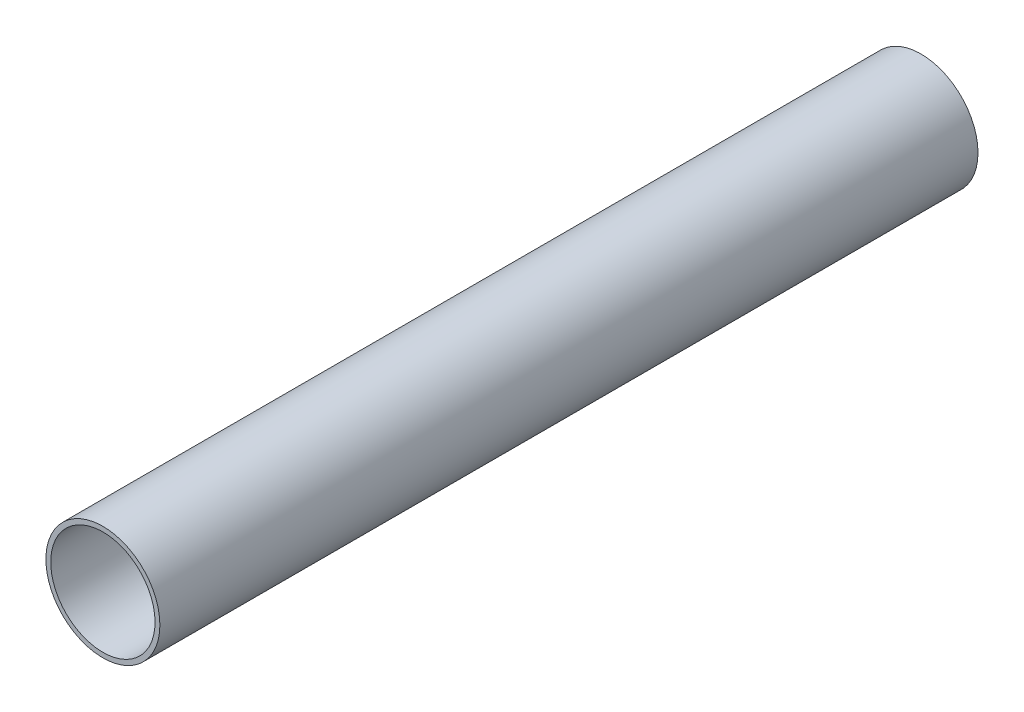
ISO-10303-21;
HEADER;
FILE_DESCRIPTION(('STEP AP214'),'2;1');
FILE_NAME('part.step','',(''),(''),'','','');
FILE_SCHEMA(('AUTOMOTIVE_DESIGN { 1 0 10303 214 1 1 1 1 }'));
ENDSEC;
DATA;
#1=APPLICATION_CONTEXT('core data for automotive mechanical design processes');
#2=APPLICATION_PROTOCOL_DEFINITION('international standard','automotive_design',2000,#1);
#3=PRODUCT_CONTEXT('',#1,'mechanical');
#4=PRODUCT('Part','Part','',(#3));
#5=PRODUCT_RELATED_PRODUCT_CATEGORY('part','',(#4));
#6=PRODUCT_DEFINITION_FORMATION('','',#4);
#7=PRODUCT_DEFINITION_CONTEXT('part definition',#1,'design');
#8=PRODUCT_DEFINITION('design','',#6,#7);
#9=PRODUCT_DEFINITION_SHAPE('','',#8);
#10=(LENGTH_UNIT() NAMED_UNIT(*) SI_UNIT(.MILLI.,.METRE.));
#11=(NAMED_UNIT(*) PLANE_ANGLE_UNIT() SI_UNIT($,.RADIAN.));
#12=(NAMED_UNIT(*) SI_UNIT($,.STERADIAN.) SOLID_ANGLE_UNIT());
#13=UNCERTAINTY_MEASURE_WITH_UNIT(LENGTH_MEASURE(1.E-05),#10,'distance_accuracy_value','');
#14=(GEOMETRIC_REPRESENTATION_CONTEXT(3) GLOBAL_UNCERTAINTY_ASSIGNED_CONTEXT((#13)) GLOBAL_UNIT_ASSIGNED_CONTEXT((#10,
#11,#12)) REPRESENTATION_CONTEXT('',''));
#15=CARTESIAN_POINT('',(0.,0.,0.));
#16=DIRECTION('',(0.,0.,1.));
#17=DIRECTION('',(1.,0.,0.));
#18=AXIS2_PLACEMENT_3D('',#15,#16,#17);
#19=CARTESIAN_POINT('',(0.,0.,150.));
#20=DIRECTION('',(0.,0.,1.));
#21=DIRECTION('',(1.,0.,0.));
#22=AXIS2_PLACEMENT_3D('',#19,#20,#21);
#23=PLANE('',#22);
#24=CARTESIAN_POINT('',(0.,0.,150.));
#25=DIRECTION('',(0.,0.,1.));
#26=DIRECTION('',(1.,0.,0.));
#27=AXIS2_PLACEMENT_3D('',#24,#25,#26);
#28=CIRCLE('',#27,10.45);
#29=CARTESIAN_POINT('',(10.45,0.,150.));
#30=VERTEX_POINT('',#29);
#31=EDGE_CURVE('E10',#30,#30,#28,.T.);
#32=ORIENTED_EDGE('',*,*,#31,.T.);
#33=EDGE_LOOP('',(#32));
#34=FACE_BOUND('',#33,.T.);
#35=CARTESIAN_POINT('',(0.,0.,150.));
#36=DIRECTION('',(0.,0.,1.));
#37=DIRECTION('',(1.,0.,0.));
#38=AXIS2_PLACEMENT_3D('',#35,#36,#37);
#39=CIRCLE('',#38,9.565);
#40=CARTESIAN_POINT('',(9.565,0.,150.));
#41=VERTEX_POINT('',#40);
#42=EDGE_CURVE('E41',#41,#41,#39,.T.);
#43=ORIENTED_EDGE('',*,*,#42,.F.);
#44=EDGE_LOOP('',(#43));
#45=FACE_BOUND('',#44,.T.);
#46=ADVANCED_FACE('F30',(#34,#45),#23,.T.);
#47=CARTESIAN_POINT('',(0.,0.,0.));
#48=DIRECTION('',(0.,0.,1.));
#49=DIRECTION('',(1.,0.,0.));
#50=AXIS2_PLACEMENT_3D('',#47,#48,#49);
#51=PLANE('',#50);
#52=CARTESIAN_POINT('',(0.,0.,0.));
#53=DIRECTION('',(0.,0.,1.));
#54=DIRECTION('',(1.,0.,0.));
#55=AXIS2_PLACEMENT_3D('',#52,#53,#54);
#56=CIRCLE('',#55,10.45);
#57=CARTESIAN_POINT('',(10.45,0.,0.));
#58=VERTEX_POINT('',#57);
#59=EDGE_CURVE('E34',#58,#58,#56,.T.);
#60=ORIENTED_EDGE('',*,*,#59,.F.);
#61=EDGE_LOOP('',(#60));
#62=FACE_BOUND('',#61,.T.);
#63=CARTESIAN_POINT('',(0.,0.,0.));
#64=DIRECTION('',(0.,0.,1.));
#65=DIRECTION('',(1.,0.,0.));
#66=AXIS2_PLACEMENT_3D('',#63,#64,#65);
#67=CIRCLE('',#66,9.565);
#68=CARTESIAN_POINT('',(9.565,0.,0.));
#69=VERTEX_POINT('',#68);
#70=EDGE_CURVE('E43',#69,#69,#67,.T.);
#71=ORIENTED_EDGE('',*,*,#70,.T.);
#72=EDGE_LOOP('',(#71));
#73=FACE_BOUND('',#72,.T.);
#74=ADVANCED_FACE('F53',(#62,#73),#51,.F.);
#75=CARTESIAN_POINT('',(0.,0.,150.));
#76=DIRECTION('',(0.,0.,-1.));
#77=DIRECTION('',(-1.,0.,0.));
#78=AXIS2_PLACEMENT_3D('',#75,#76,#77);
#79=CYLINDRICAL_SURFACE('',#78,10.45);
#80=ORIENTED_EDGE('',*,*,#31,.F.);
#81=EDGE_LOOP('',(#80));
#82=FACE_BOUND('',#81,.T.);
#83=ORIENTED_EDGE('',*,*,#59,.T.);
#84=EDGE_LOOP('',(#83));
#85=FACE_BOUND('',#84,.T.);
#86=ADVANCED_FACE('F32',(#82,#85),#79,.T.);
#87=CARTESIAN_POINT('',(0.,0.,150.));
#88=DIRECTION('',(0.,0.,-1.));
#89=DIRECTION('',(-1.,0.,0.));
#90=AXIS2_PLACEMENT_3D('',#87,#88,#89);
#91=CYLINDRICAL_SURFACE('',#90,9.565);
#92=ORIENTED_EDGE('',*,*,#42,.T.);
#93=EDGE_LOOP('',(#92));
#94=FACE_BOUND('',#93,.T.);
#95=ORIENTED_EDGE('',*,*,#70,.F.);
#96=EDGE_LOOP('',(#95));
#97=FACE_BOUND('',#96,.T.);
#98=ADVANCED_FACE('F49',(#94,#97),#91,.F.);
#99=CLOSED_SHELL('',(#46,#74,#86,#98));
#100=MANIFOLD_SOLID_BREP('B2',#99);
#101=ADVANCED_BREP_SHAPE_REPRESENTATION('',(#18,#100),#14);
#102=SHAPE_DEFINITION_REPRESENTATION(#9,#101);
ENDSEC;
END-ISO-10303-21;
